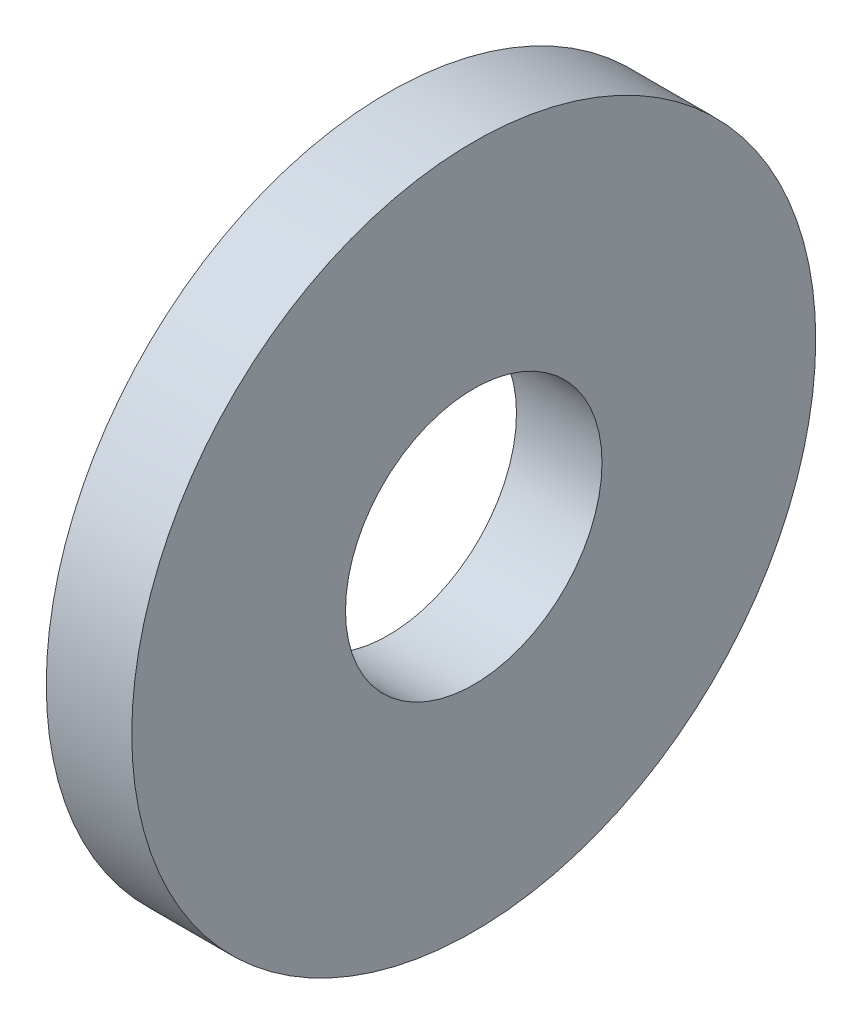
ISO-10303-21;
HEADER;
FILE_DESCRIPTION(('STEP AP214'),'2;1');
FILE_NAME('part.step','',(''),(''),'','','');
FILE_SCHEMA(('AUTOMOTIVE_DESIGN { 1 0 10303 214 1 1 1 1 }'));
ENDSEC;
DATA;
#1=APPLICATION_CONTEXT('core data for automotive mechanical design processes');
#2=APPLICATION_PROTOCOL_DEFINITION('international standard','automotive_design',2000,#1);
#3=PRODUCT_CONTEXT('',#1,'mechanical');
#4=PRODUCT('Part','Part','',(#3));
#5=PRODUCT_RELATED_PRODUCT_CATEGORY('part','',(#4));
#6=PRODUCT_DEFINITION_FORMATION('','',#4);
#7=PRODUCT_DEFINITION_CONTEXT('part definition',#1,'design');
#8=PRODUCT_DEFINITION('design','',#6,#7);
#9=PRODUCT_DEFINITION_SHAPE('','',#8);
#10=(LENGTH_UNIT() NAMED_UNIT(*) SI_UNIT(.MILLI.,.METRE.));
#11=(NAMED_UNIT(*) PLANE_ANGLE_UNIT() SI_UNIT($,.RADIAN.));
#12=(NAMED_UNIT(*) SI_UNIT($,.STERADIAN.) SOLID_ANGLE_UNIT());
#13=UNCERTAINTY_MEASURE_WITH_UNIT(LENGTH_MEASURE(1.E-05),#10,'distance_accuracy_value','');
#14=(GEOMETRIC_REPRESENTATION_CONTEXT(3) GLOBAL_UNCERTAINTY_ASSIGNED_CONTEXT((#13)) GLOBAL_UNIT_ASSIGNED_CONTEXT((#10,
#11,#12)) REPRESENTATION_CONTEXT('',''));
#15=CARTESIAN_POINT('',(0.,0.,0.));
#16=DIRECTION('',(0.,0.,1.));
#17=DIRECTION('',(1.,0.,0.));
#18=AXIS2_PLACEMENT_3D('',#15,#16,#17);
#19=CARTESIAN_POINT('',(-0.5,4.,0.));
#20=DIRECTION('',(1.,0.,0.));
#21=DIRECTION('',(0.,0.,-1.));
#22=AXIS2_PLACEMENT_3D('',#19,#20,#21);
#23=PLANE('',#22);
#24=CARTESIAN_POINT('',(-0.5,0.,0.));
#25=DIRECTION('',(-1.,0.,0.));
#26=DIRECTION('',(0.,0.,1.));
#27=AXIS2_PLACEMENT_3D('',#24,#25,#26);
#28=CIRCLE('',#27,1.5);
#29=CARTESIAN_POINT('',(-0.5,0.,1.5));
#30=VERTEX_POINT('',#29);
#31=EDGE_CURVE('E10',#30,#30,#28,.T.);
#32=ORIENTED_EDGE('',*,*,#31,.F.);
#33=EDGE_LOOP('',(#32));
#34=FACE_BOUND('',#33,.T.);
#35=CARTESIAN_POINT('',(-0.5,0.,0.));
#36=DIRECTION('',(-1.,0.,0.));
#37=DIRECTION('',(0.,0.,1.));
#38=AXIS2_PLACEMENT_3D('',#35,#36,#37);
#39=CIRCLE('',#38,4.);
#40=CARTESIAN_POINT('',(-0.5,0.,4.));
#41=VERTEX_POINT('',#40);
#42=EDGE_CURVE('E49',#41,#41,#39,.T.);
#43=ORIENTED_EDGE('',*,*,#42,.T.);
#44=EDGE_LOOP('',(#43));
#45=FACE_BOUND('',#44,.T.);
#46=ADVANCED_FACE('F35',(#34,#45),#23,.F.);
#47=CARTESIAN_POINT('',(0.,0.,0.));
#48=DIRECTION('',(-1.,0.,0.));
#49=DIRECTION('',(0.,0.,1.));
#50=AXIS2_PLACEMENT_3D('',#47,#48,#49);
#51=CYLINDRICAL_SURFACE('',#50,1.5);
#52=CARTESIAN_POINT('',(0.5,0.,0.));
#53=DIRECTION('',(-1.,0.,0.));
#54=DIRECTION('',(0.,0.,1.));
#55=AXIS2_PLACEMENT_3D('',#52,#53,#54);
#56=CIRCLE('',#55,1.5);
#57=CARTESIAN_POINT('',(0.5,0.,1.5));
#58=VERTEX_POINT('',#57);
#59=EDGE_CURVE('E41',#58,#58,#56,.T.);
#60=ORIENTED_EDGE('',*,*,#59,.F.);
#61=EDGE_LOOP('',(#60));
#62=FACE_BOUND('',#61,.T.);
#63=ORIENTED_EDGE('',*,*,#31,.T.);
#64=EDGE_LOOP('',(#63));
#65=FACE_BOUND('',#64,.T.);
#66=ADVANCED_FACE('F64',(#62,#65),#51,.F.);
#67=CARTESIAN_POINT('',(0.5,4.,0.));
#68=DIRECTION('',(-1.,0.,0.));
#69=DIRECTION('',(0.,0.,1.));
#70=AXIS2_PLACEMENT_3D('',#67,#68,#69);
#71=PLANE('',#70);
#72=CARTESIAN_POINT('',(0.5,0.,0.));
#73=DIRECTION('',(-1.,0.,0.));
#74=DIRECTION('',(0.,0.,1.));
#75=AXIS2_PLACEMENT_3D('',#72,#73,#74);
#76=CIRCLE('',#75,4.);
#77=CARTESIAN_POINT('',(0.5,0.,4.));
#78=VERTEX_POINT('',#77);
#79=EDGE_CURVE('E45',#78,#78,#76,.T.);
#80=ORIENTED_EDGE('',*,*,#79,.F.);
#81=EDGE_LOOP('',(#80));
#82=FACE_BOUND('',#81,.T.);
#83=ORIENTED_EDGE('',*,*,#59,.T.);
#84=EDGE_LOOP('',(#83));
#85=FACE_BOUND('',#84,.T.);
#86=ADVANCED_FACE('F59',(#82,#85),#71,.F.);
#87=CARTESIAN_POINT('',(0.,0.,0.));
#88=DIRECTION('',(-1.,0.,0.));
#89=DIRECTION('',(0.,0.,1.));
#90=AXIS2_PLACEMENT_3D('',#87,#88,#89);
#91=CYLINDRICAL_SURFACE('',#90,4.);
#92=ORIENTED_EDGE('',*,*,#42,.F.);
#93=EDGE_LOOP('',(#92));
#94=FACE_BOUND('',#93,.T.);
#95=ORIENTED_EDGE('',*,*,#79,.T.);
#96=EDGE_LOOP('',(#95));
#97=FACE_BOUND('',#96,.T.);
#98=ADVANCED_FACE('F56',(#94,#97),#91,.T.);
#99=CLOSED_SHELL('',(#46,#66,#86,#98));
#100=MANIFOLD_SOLID_BREP('B2',#99);
#101=ADVANCED_BREP_SHAPE_REPRESENTATION('',(#18,#100),#14);
#102=SHAPE_DEFINITION_REPRESENTATION(#9,#101);
ENDSEC;
END-ISO-10303-21;
